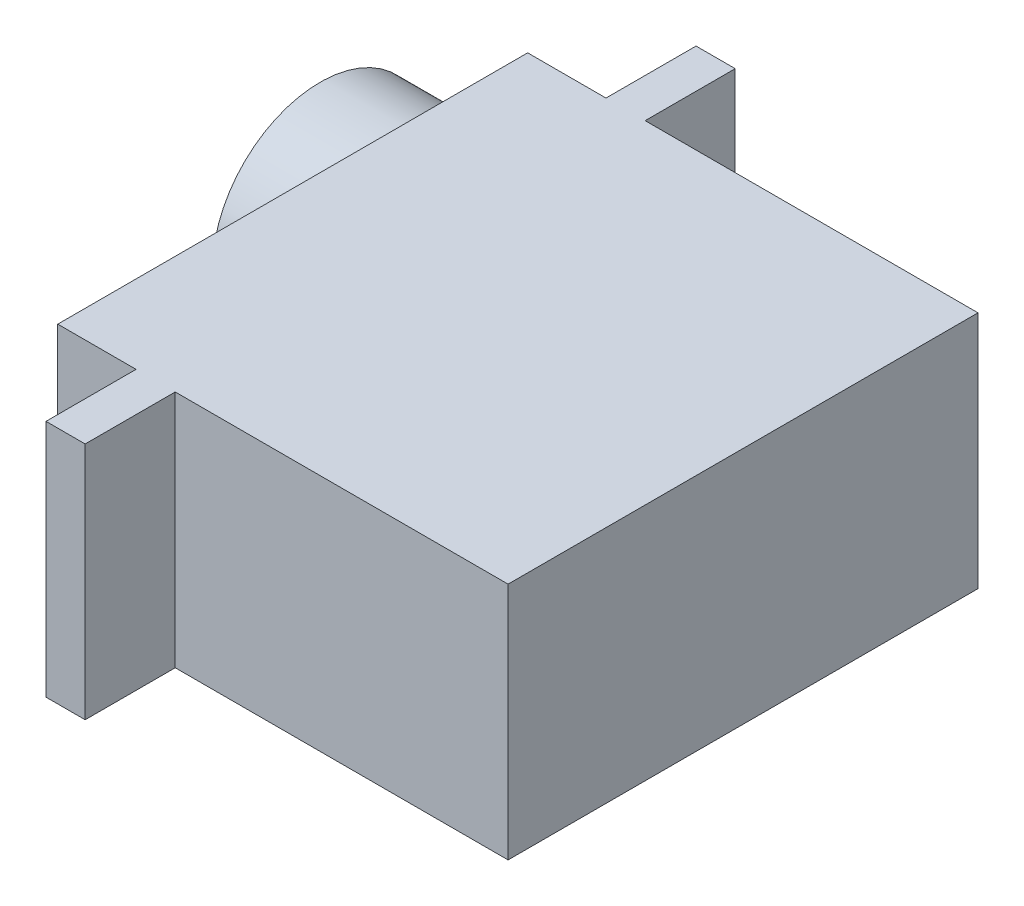
ISO-10303-21;
HEADER;
FILE_DESCRIPTION(('STEP AP214'),'2;1');
FILE_NAME('part.step','',(''),(''),'','','');
FILE_SCHEMA(('AUTOMOTIVE_DESIGN { 1 0 10303 214 1 1 1 1 }'));
ENDSEC;
DATA;
#1=APPLICATION_CONTEXT('core data for automotive mechanical design processes');
#2=APPLICATION_PROTOCOL_DEFINITION('international standard','automotive_design',2000,#1);
#3=PRODUCT_CONTEXT('',#1,'mechanical');
#4=PRODUCT('Part','Part','',(#3));
#5=PRODUCT_RELATED_PRODUCT_CATEGORY('part','',(#4));
#6=PRODUCT_DEFINITION_FORMATION('','',#4);
#7=PRODUCT_DEFINITION_CONTEXT('part definition',#1,'design');
#8=PRODUCT_DEFINITION('design','',#6,#7);
#9=PRODUCT_DEFINITION_SHAPE('','',#8);
#10=(LENGTH_UNIT() NAMED_UNIT(*) SI_UNIT(.MILLI.,.METRE.));
#11=(NAMED_UNIT(*) PLANE_ANGLE_UNIT() SI_UNIT($,.RADIAN.));
#12=(NAMED_UNIT(*) SI_UNIT($,.STERADIAN.) SOLID_ANGLE_UNIT());
#13=UNCERTAINTY_MEASURE_WITH_UNIT(LENGTH_MEASURE(1.E-05),#10,'distance_accuracy_value','');
#14=(GEOMETRIC_REPRESENTATION_CONTEXT(3) GLOBAL_UNCERTAINTY_ASSIGNED_CONTEXT((#13)) GLOBAL_UNIT_ASSIGNED_CONTEXT((#10,
#11,#12)) REPRESENTATION_CONTEXT('',''));
#15=CARTESIAN_POINT('',(0.,0.,0.));
#16=DIRECTION('',(0.,0.,1.));
#17=DIRECTION('',(1.,0.,0.));
#18=AXIS2_PLACEMENT_3D('',#15,#16,#17);
#19=CARTESIAN_POINT('',(0.,0.,24.));
#20=DIRECTION('',(0.,0.,-1.));
#21=DIRECTION('',(-1.,0.,0.));
#22=AXIS2_PLACEMENT_3D('',#19,#20,#21);
#23=PLANE('',#22);
#24=DIRECTION('',(1.,0.,0.));
#25=VECTOR('',#24,1.);
#26=CARTESIAN_POINT('',(0.,0.,24.));
#27=LINE('',#26,#25);
#28=CARTESIAN_POINT('',(0.,0.,24.));
#29=VERTEX_POINT('',#28);
#30=CARTESIAN_POINT('',(4.,0.,24.));
#31=VERTEX_POINT('',#30);
#32=EDGE_CURVE('E208',#29,#31,#27,.T.);
#33=ORIENTED_EDGE('',*,*,#32,.T.);
#34=DIRECTION('',(0.,1.,0.));
#35=VECTOR('',#34,1.);
#36=CARTESIAN_POINT('',(4.,0.,24.));
#37=LINE('',#36,#35);
#38=CARTESIAN_POINT('',(4.,12.2,24.));
#39=VERTEX_POINT('',#38);
#40=EDGE_CURVE('E56',#31,#39,#37,.T.);
#41=ORIENTED_EDGE('',*,*,#40,.T.);
#42=DIRECTION('',(-1.,0.,0.));
#43=VECTOR('',#42,1.);
#44=CARTESIAN_POINT('',(0.,12.2,24.));
#45=LINE('',#44,#43);
#46=CARTESIAN_POINT('',(0.,12.2,24.));
#47=VERTEX_POINT('',#46);
#48=EDGE_CURVE('E214',#39,#47,#45,.T.);
#49=ORIENTED_EDGE('',*,*,#48,.T.);
#50=DIRECTION('',(0.,-1.,0.));
#51=VECTOR('',#50,1.);
#52=CARTESIAN_POINT('',(0.,0.,24.));
#53=LINE('',#52,#51);
#54=EDGE_CURVE('E202',#47,#29,#53,.T.);
#55=ORIENTED_EDGE('',*,*,#54,.T.);
#56=EDGE_LOOP('',(#33,#41,#49,#55));
#57=FACE_BOUND('',#56,.T.);
#58=ADVANCED_FACE('F39',(#57),#23,.F.);
#59=CARTESIAN_POINT('',(0.,0.,0.));
#60=DIRECTION('',(0.,0.,-1.));
#61=DIRECTION('',(-1.,0.,0.));
#62=AXIS2_PLACEMENT_3D('',#59,#60,#61);
#63=PLANE('',#62);
#64=DIRECTION('',(0.,1.,0.));
#65=VECTOR('',#64,1.);
#66=CARTESIAN_POINT('',(4.,0.,0.));
#67=LINE('',#66,#65);
#68=CARTESIAN_POINT('',(4.,0.,0.));
#69=VERTEX_POINT('',#68);
#70=CARTESIAN_POINT('',(4.,12.2,0.));
#71=VERTEX_POINT('',#70);
#72=EDGE_CURVE('E43',#69,#71,#67,.T.);
#73=ORIENTED_EDGE('',*,*,#72,.F.);
#74=DIRECTION('',(1.,0.,0.));
#75=VECTOR('',#74,1.);
#76=CARTESIAN_POINT('',(0.,0.,0.));
#77=LINE('',#76,#75);
#78=CARTESIAN_POINT('',(0.,0.,0.));
#79=VERTEX_POINT('',#78);
#80=EDGE_CURVE('E222',#79,#69,#77,.T.);
#81=ORIENTED_EDGE('',*,*,#80,.F.);
#82=DIRECTION('',(0.,-1.,0.));
#83=VECTOR('',#82,1.);
#84=CARTESIAN_POINT('',(0.,0.,0.));
#85=LINE('',#84,#83);
#86=CARTESIAN_POINT('',(0.,12.2,0.));
#87=VERTEX_POINT('',#86);
#88=EDGE_CURVE('E201',#87,#79,#85,.T.);
#89=ORIENTED_EDGE('',*,*,#88,.F.);
#90=DIRECTION('',(-1.,0.,0.));
#91=VECTOR('',#90,1.);
#92=CARTESIAN_POINT('',(0.,12.2,0.));
#93=LINE('',#92,#91);
#94=EDGE_CURVE('E229',#71,#87,#93,.T.);
#95=ORIENTED_EDGE('',*,*,#94,.F.);
#96=EDGE_LOOP('',(#73,#81,#89,#95));
#97=FACE_BOUND('',#96,.T.);
#98=ADVANCED_FACE('F265',(#97),#63,.T.);
#99=CARTESIAN_POINT('',(0.,0.,24.));
#100=DIRECTION('',(1.,0.,0.));
#101=DIRECTION('',(0.,0.,-1.));
#102=AXIS2_PLACEMENT_3D('',#99,#100,#101);
#103=PLANE('',#102);
#104=CARTESIAN_POINT('',(0.,6.1,6.));
#105=DIRECTION('',(-1.,0.,0.));
#106=DIRECTION('',(0.,0.,1.));
#107=AXIS2_PLACEMENT_3D('',#104,#105,#106);
#108=CIRCLE('',#107,5.5);
#109=CARTESIAN_POINT('',(0.,6.1,11.5));
#110=VERTEX_POINT('',#109);
#111=EDGE_CURVE('E11',#110,#110,#108,.T.);
#112=ORIENTED_EDGE('',*,*,#111,.F.);
#113=EDGE_LOOP('',(#112));
#114=FACE_BOUND('',#113,.T.);
#115=ORIENTED_EDGE('',*,*,#88,.T.);
#116=DIRECTION('',(0.,0.,-1.));
#117=VECTOR('',#116,1.);
#118=CARTESIAN_POINT('',(0.,0.,24.));
#119=LINE('',#118,#117);
#120=EDGE_CURVE('E244',#29,#79,#119,.T.);
#121=ORIENTED_EDGE('',*,*,#120,.F.);
#122=ORIENTED_EDGE('',*,*,#54,.F.);
#123=DIRECTION('',(0.,0.,-1.));
#124=VECTOR('',#123,1.);
#125=CARTESIAN_POINT('',(0.,12.2,24.));
#126=LINE('',#125,#124);
#127=EDGE_CURVE('E217',#47,#87,#126,.T.);
#128=ORIENTED_EDGE('',*,*,#127,.T.);
#129=EDGE_LOOP('',(#115,#121,#122,#128));
#130=FACE_BOUND('',#129,.T.);
#131=ADVANCED_FACE('F41',(#114,#130),#103,.F.);
#132=CARTESIAN_POINT('',(0.,0.,24.));
#133=DIRECTION('',(0.,1.,0.));
#134=DIRECTION('',(0.,0.,1.));
#135=AXIS2_PLACEMENT_3D('',#132,#133,#134);
#136=PLANE('',#135);
#137=CARTESIAN_POINT('',(6.,0.,24.));
#138=VERTEX_POINT('',#137);
#139=CARTESIAN_POINT('',(23.,0.,24.));
#140=VERTEX_POINT('',#139);
#141=EDGE_CURVE('E206',#138,#140,#27,.T.);
#142=ORIENTED_EDGE('',*,*,#141,.F.);
#143=DIRECTION('',(0.,0.,1.));
#144=VECTOR('',#143,1.);
#145=CARTESIAN_POINT('',(6.,0.,-4.6));
#146=LINE('',#145,#144);
#147=CARTESIAN_POINT('',(6.,0.,28.6));
#148=VERTEX_POINT('',#147);
#149=EDGE_CURVE('E146',#138,#148,#146,.T.);
#150=ORIENTED_EDGE('',*,*,#149,.T.);
#151=DIRECTION('',(1.,0.,0.));
#152=VECTOR('',#151,1.);
#153=CARTESIAN_POINT('',(4.,0.,28.6));
#154=LINE('',#153,#152);
#155=CARTESIAN_POINT('',(4.,0.,28.6));
#156=VERTEX_POINT('',#155);
#157=EDGE_CURVE('E143',#156,#148,#154,.T.);
#158=ORIENTED_EDGE('',*,*,#157,.F.);
#159=DIRECTION('',(0.,0.,1.));
#160=VECTOR('',#159,1.);
#161=CARTESIAN_POINT('',(4.,0.,-4.6));
#162=LINE('',#161,#160);
#163=EDGE_CURVE('E131',#31,#156,#162,.T.);
#164=ORIENTED_EDGE('',*,*,#163,.F.);
#165=ORIENTED_EDGE('',*,*,#32,.F.);
#166=ORIENTED_EDGE('',*,*,#120,.T.);
#167=ORIENTED_EDGE('',*,*,#80,.T.);
#168=CARTESIAN_POINT('',(4.,0.,-4.6));
#169=VERTEX_POINT('',#168);
#170=EDGE_CURVE('E139',#169,#69,#162,.T.);
#171=ORIENTED_EDGE('',*,*,#170,.F.);
#172=DIRECTION('',(1.,0.,0.));
#173=VECTOR('',#172,1.);
#174=CARTESIAN_POINT('',(4.,0.,-4.6));
#175=LINE('',#174,#173);
#176=CARTESIAN_POINT('',(6.,0.,-4.6));
#177=VERTEX_POINT('',#176);
#178=EDGE_CURVE('E172',#169,#177,#175,.T.);
#179=ORIENTED_EDGE('',*,*,#178,.T.);
#180=CARTESIAN_POINT('',(6.,0.,0.));
#181=VERTEX_POINT('',#180);
#182=EDGE_CURVE('E193',#177,#181,#146,.T.);
#183=ORIENTED_EDGE('',*,*,#182,.T.);
#184=CARTESIAN_POINT('',(23.,0.,0.));
#185=VERTEX_POINT('',#184);
#186=EDGE_CURVE('E221',#181,#185,#77,.T.);
#187=ORIENTED_EDGE('',*,*,#186,.T.);
#188=DIRECTION('',(0.,0.,-1.));
#189=VECTOR('',#188,1.);
#190=CARTESIAN_POINT('',(23.,0.,24.));
#191=LINE('',#190,#189);
#192=EDGE_CURVE('E240',#140,#185,#191,.T.);
#193=ORIENTED_EDGE('',*,*,#192,.F.);
#194=EDGE_LOOP('',(#142,#150,#158,#164,#165,#166,#167,#171,#179,#183,#187,#193));
#195=FACE_BOUND('',#194,.T.);
#196=ADVANCED_FACE('F144',(#195),#136,.F.);
#197=CARTESIAN_POINT('',(23.,0.,24.));
#198=DIRECTION('',(-1.,0.,0.));
#199=DIRECTION('',(0.,0.,1.));
#200=AXIS2_PLACEMENT_3D('',#197,#198,#199);
#201=PLANE('',#200);
#202=DIRECTION('',(0.,1.,0.));
#203=VECTOR('',#202,1.);
#204=CARTESIAN_POINT('',(23.,0.,0.));
#205=LINE('',#204,#203);
#206=CARTESIAN_POINT('',(23.,12.2,0.));
#207=VERTEX_POINT('',#206);
#208=EDGE_CURVE('E226',#185,#207,#205,.T.);
#209=ORIENTED_EDGE('',*,*,#208,.T.);
#210=DIRECTION('',(0.,0.,-1.));
#211=VECTOR('',#210,1.);
#212=CARTESIAN_POINT('',(23.,12.2,24.));
#213=LINE('',#212,#211);
#214=CARTESIAN_POINT('',(23.,12.2,24.));
#215=VERTEX_POINT('',#214);
#216=EDGE_CURVE('E236',#215,#207,#213,.T.);
#217=ORIENTED_EDGE('',*,*,#216,.F.);
#218=DIRECTION('',(0.,1.,0.));
#219=VECTOR('',#218,1.);
#220=CARTESIAN_POINT('',(23.,0.,24.));
#221=LINE('',#220,#219);
#222=EDGE_CURVE('E211',#140,#215,#221,.T.);
#223=ORIENTED_EDGE('',*,*,#222,.F.);
#224=ORIENTED_EDGE('',*,*,#192,.T.);
#225=EDGE_LOOP('',(#209,#217,#223,#224));
#226=FACE_BOUND('',#225,.T.);
#227=ADVANCED_FACE('F283',(#226),#201,.F.);
#228=CARTESIAN_POINT('',(0.,12.2,24.));
#229=DIRECTION('',(0.,-1.,0.));
#230=DIRECTION('',(0.,0.,-1.));
#231=AXIS2_PLACEMENT_3D('',#228,#229,#230);
#232=PLANE('',#231);
#233=CARTESIAN_POINT('',(6.,12.2,0.));
#234=VERTEX_POINT('',#233);
#235=EDGE_CURVE('E207',#207,#234,#93,.T.);
#236=ORIENTED_EDGE('',*,*,#235,.T.);
#237=DIRECTION('',(0.,0.,1.));
#238=VECTOR('',#237,1.);
#239=CARTESIAN_POINT('',(6.,12.2,-4.6));
#240=LINE('',#239,#238);
#241=CARTESIAN_POINT('',(6.,12.2,-4.6));
#242=VERTEX_POINT('',#241);
#243=EDGE_CURVE('E189',#242,#234,#240,.T.);
#244=ORIENTED_EDGE('',*,*,#243,.F.);
#245=DIRECTION('',(-1.,0.,0.));
#246=VECTOR('',#245,1.);
#247=CARTESIAN_POINT('',(4.,12.2,-4.6));
#248=LINE('',#247,#246);
#249=CARTESIAN_POINT('',(4.,12.2,-4.6));
#250=VERTEX_POINT('',#249);
#251=EDGE_CURVE('E140',#242,#250,#248,.T.);
#252=ORIENTED_EDGE('',*,*,#251,.T.);
#253=DIRECTION('',(0.,0.,1.));
#254=VECTOR('',#253,1.);
#255=CARTESIAN_POINT('',(4.,12.2,-4.6));
#256=LINE('',#255,#254);
#257=EDGE_CURVE('E183',#250,#71,#256,.T.);
#258=ORIENTED_EDGE('',*,*,#257,.T.);
#259=ORIENTED_EDGE('',*,*,#94,.T.);
#260=ORIENTED_EDGE('',*,*,#127,.F.);
#261=ORIENTED_EDGE('',*,*,#48,.F.);
#262=CARTESIAN_POINT('',(4.,12.2,28.6));
#263=VERTEX_POINT('',#262);
#264=EDGE_CURVE('E188',#39,#263,#256,.T.);
#265=ORIENTED_EDGE('',*,*,#264,.T.);
#266=DIRECTION('',(-1.,0.,0.));
#267=VECTOR('',#266,1.);
#268=CARTESIAN_POINT('',(4.,12.2,28.6));
#269=LINE('',#268,#267);
#270=CARTESIAN_POINT('',(6.,12.2,28.6));
#271=VERTEX_POINT('',#270);
#272=EDGE_CURVE('E156',#271,#263,#269,.T.);
#273=ORIENTED_EDGE('',*,*,#272,.F.);
#274=CARTESIAN_POINT('',(6.,12.2,24.));
#275=VERTEX_POINT('',#274);
#276=EDGE_CURVE('E192',#275,#271,#240,.T.);
#277=ORIENTED_EDGE('',*,*,#276,.F.);
#278=EDGE_CURVE('E64',#215,#275,#45,.T.);
#279=ORIENTED_EDGE('',*,*,#278,.F.);
#280=ORIENTED_EDGE('',*,*,#216,.T.);
#281=EDGE_LOOP('',(#236,#244,#252,#258,#259,#260,#261,#265,#273,#277,#279,#280));
#282=FACE_BOUND('',#281,.T.);
#283=ADVANCED_FACE('F261',(#282),#232,.F.);
#284=ORIENTED_EDGE('',*,*,#278,.T.);
#285=DIRECTION('',(0.,-1.,0.));
#286=VECTOR('',#285,1.);
#287=CARTESIAN_POINT('',(6.,0.,24.));
#288=LINE('',#287,#286);
#289=EDGE_CURVE('E187',#275,#138,#288,.T.);
#290=ORIENTED_EDGE('',*,*,#289,.T.);
#291=ORIENTED_EDGE('',*,*,#141,.T.);
#292=ORIENTED_EDGE('',*,*,#222,.T.);
#293=EDGE_LOOP('',(#284,#290,#291,#292));
#294=FACE_BOUND('',#293,.T.);
#295=ADVANCED_FACE('F278',(#294),#23,.F.);
#296=DIRECTION('',(0.,-1.,0.));
#297=VECTOR('',#296,1.);
#298=CARTESIAN_POINT('',(6.,0.,0.));
#299=LINE('',#298,#297);
#300=EDGE_CURVE('E247',#234,#181,#299,.T.);
#301=ORIENTED_EDGE('',*,*,#300,.F.);
#302=ORIENTED_EDGE('',*,*,#235,.F.);
#303=ORIENTED_EDGE('',*,*,#208,.F.);
#304=ORIENTED_EDGE('',*,*,#186,.F.);
#305=EDGE_LOOP('',(#301,#302,#303,#304));
#306=FACE_BOUND('',#305,.T.);
#307=ADVANCED_FACE('F286',(#306),#63,.T.);
#308=CARTESIAN_POINT('',(0.,0.,-4.6));
#309=DIRECTION('',(0.,0.,1.));
#310=DIRECTION('',(1.,0.,0.));
#311=AXIS2_PLACEMENT_3D('',#308,#309,#310);
#312=PLANE('',#311);
#313=DIRECTION('',(0.,-1.,0.));
#314=VECTOR('',#313,1.);
#315=CARTESIAN_POINT('',(4.,12.2,-4.6));
#316=LINE('',#315,#314);
#317=EDGE_CURVE('E168',#250,#169,#316,.T.);
#318=ORIENTED_EDGE('',*,*,#317,.F.);
#319=ORIENTED_EDGE('',*,*,#251,.F.);
#320=DIRECTION('',(0.,1.,0.));
#321=VECTOR('',#320,1.);
#322=CARTESIAN_POINT('',(6.,12.2,-4.6));
#323=LINE('',#322,#321);
#324=EDGE_CURVE('E176',#177,#242,#323,.T.);
#325=ORIENTED_EDGE('',*,*,#324,.F.);
#326=ORIENTED_EDGE('',*,*,#178,.F.);
#327=EDGE_LOOP('',(#318,#319,#325,#326));
#328=FACE_BOUND('',#327,.T.);
#329=ADVANCED_FACE('F288',(#328),#312,.F.);
#330=CARTESIAN_POINT('',(6.,12.2,-4.6));
#331=DIRECTION('',(1.,0.,0.));
#332=DIRECTION('',(0.,1.,0.));
#333=AXIS2_PLACEMENT_3D('',#330,#331,#332);
#334=PLANE('',#333);
#335=ORIENTED_EDGE('',*,*,#243,.T.);
#336=ORIENTED_EDGE('',*,*,#300,.T.);
#337=ORIENTED_EDGE('',*,*,#182,.F.);
#338=ORIENTED_EDGE('',*,*,#324,.T.);
#339=EDGE_LOOP('',(#335,#336,#337,#338));
#340=FACE_BOUND('',#339,.T.);
#341=ADVANCED_FACE('F294',(#340),#334,.T.);
#342=CARTESIAN_POINT('',(4.,12.2,-4.6));
#343=DIRECTION('',(-1.,0.,0.));
#344=DIRECTION('',(0.,-1.,0.));
#345=AXIS2_PLACEMENT_3D('',#342,#343,#344);
#346=PLANE('',#345);
#347=ORIENTED_EDGE('',*,*,#170,.T.);
#348=ORIENTED_EDGE('',*,*,#72,.T.);
#349=ORIENTED_EDGE('',*,*,#257,.F.);
#350=ORIENTED_EDGE('',*,*,#317,.T.);
#351=EDGE_LOOP('',(#347,#348,#349,#350));
#352=FACE_BOUND('',#351,.T.);
#353=ADVANCED_FACE('F256',(#352),#346,.T.);
#354=ORIENTED_EDGE('',*,*,#40,.F.);
#355=ORIENTED_EDGE('',*,*,#163,.T.);
#356=DIRECTION('',(0.,-1.,0.));
#357=VECTOR('',#356,1.);
#358=CARTESIAN_POINT('',(4.,12.2,28.6));
#359=LINE('',#358,#357);
#360=EDGE_CURVE('E136',#263,#156,#359,.T.);
#361=ORIENTED_EDGE('',*,*,#360,.F.);
#362=ORIENTED_EDGE('',*,*,#264,.F.);
#363=EDGE_LOOP('',(#354,#355,#361,#362));
#364=FACE_BOUND('',#363,.T.);
#365=ADVANCED_FACE('F133',(#364),#346,.T.);
#366=ORIENTED_EDGE('',*,*,#289,.F.);
#367=ORIENTED_EDGE('',*,*,#276,.T.);
#368=DIRECTION('',(0.,1.,0.));
#369=VECTOR('',#368,1.);
#370=CARTESIAN_POINT('',(6.,12.2,28.6));
#371=LINE('',#370,#369);
#372=EDGE_CURVE('E151',#148,#271,#371,.T.);
#373=ORIENTED_EDGE('',*,*,#372,.F.);
#374=ORIENTED_EDGE('',*,*,#149,.F.);
#375=EDGE_LOOP('',(#366,#367,#373,#374));
#376=FACE_BOUND('',#375,.T.);
#377=ADVANCED_FACE('F273',(#376),#334,.T.);
#378=CARTESIAN_POINT('',(0.,0.,28.6));
#379=DIRECTION('',(0.,0.,1.));
#380=DIRECTION('',(1.,0.,0.));
#381=AXIS2_PLACEMENT_3D('',#378,#379,#380);
#382=PLANE('',#381);
#383=ORIENTED_EDGE('',*,*,#360,.T.);
#384=ORIENTED_EDGE('',*,*,#157,.T.);
#385=ORIENTED_EDGE('',*,*,#372,.T.);
#386=ORIENTED_EDGE('',*,*,#272,.T.);
#387=EDGE_LOOP('',(#383,#384,#385,#386));
#388=FACE_BOUND('',#387,.T.);
#389=ADVANCED_FACE('F154',(#388),#382,.T.);
#390=CARTESIAN_POINT('',(-4.6,6.1,6.));
#391=DIRECTION('',(1.,0.,0.));
#392=DIRECTION('',(0.,0.,-1.));
#393=AXIS2_PLACEMENT_3D('',#390,#391,#392);
#394=CYLINDRICAL_SURFACE('',#393,5.5);
#395=CARTESIAN_POINT('',(-4.6,6.1,6.));
#396=DIRECTION('',(-1.,0.,0.));
#397=DIRECTION('',(0.,0.,1.));
#398=AXIS2_PLACEMENT_3D('',#395,#396,#397);
#399=CIRCLE('',#398,5.5);
#400=CARTESIAN_POINT('',(-4.6,6.1,11.5));
#401=VERTEX_POINT('',#400);
#402=EDGE_CURVE('E158',#401,#401,#399,.T.);
#403=ORIENTED_EDGE('',*,*,#402,.F.);
#404=EDGE_LOOP('',(#403));
#405=FACE_BOUND('',#404,.T.);
#406=ORIENTED_EDGE('',*,*,#111,.T.);
#407=EDGE_LOOP('',(#406));
#408=FACE_BOUND('',#407,.T.);
#409=ADVANCED_FACE('F310',(#405,#408),#394,.T.);
#410=CARTESIAN_POINT('',(-4.6,6.1,6.));
#411=DIRECTION('',(-1.,0.,0.));
#412=DIRECTION('',(0.,0.,1.));
#413=AXIS2_PLACEMENT_3D('',#410,#411,#412);
#414=PLANE('',#413);
#415=ORIENTED_EDGE('',*,*,#402,.T.);
#416=EDGE_LOOP('',(#415));
#417=FACE_BOUND('',#416,.T.);
#418=ADVANCED_FACE('F313',(#417),#414,.T.);
#419=CLOSED_SHELL('',(#58,#98,#131,#196,#227,#283,#295,#307,#329,#341,#353,#365,#377,#389,#409,#418));
#420=MANIFOLD_SOLID_BREP('B2',#419);
#421=ADVANCED_BREP_SHAPE_REPRESENTATION('',(#18,#420),#14);
#422=SHAPE_DEFINITION_REPRESENTATION(#9,#421);
ENDSEC;
END-ISO-10303-21;
